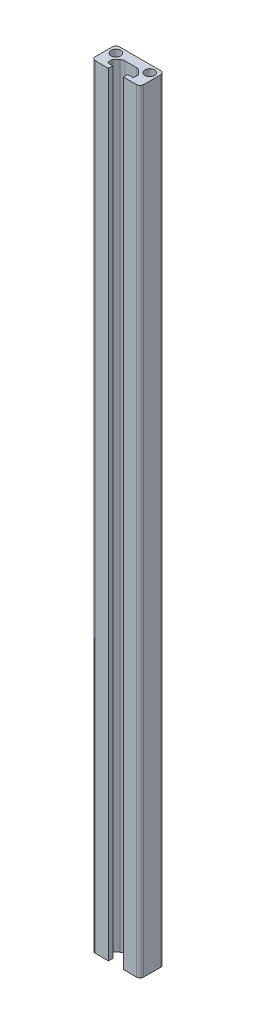
ISO-10303-21;
HEADER;
FILE_DESCRIPTION(('STEP AP214'),'2;1');
FILE_NAME('part.step','',(''),(''),'','','');
FILE_SCHEMA(('AUTOMOTIVE_DESIGN { 1 0 10303 214 1 1 1 1 }'));
ENDSEC;
DATA;
#1=APPLICATION_CONTEXT('core data for automotive mechanical design processes');
#2=APPLICATION_PROTOCOL_DEFINITION('international standard','automotive_design',2000,#1);
#3=PRODUCT_CONTEXT('',#1,'mechanical');
#4=PRODUCT('Part','Part','',(#3));
#5=PRODUCT_RELATED_PRODUCT_CATEGORY('part','',(#4));
#6=PRODUCT_DEFINITION_FORMATION('','',#4);
#7=PRODUCT_DEFINITION_CONTEXT('part definition',#1,'design');
#8=PRODUCT_DEFINITION('design','',#6,#7);
#9=PRODUCT_DEFINITION_SHAPE('','',#8);
#10=(LENGTH_UNIT() NAMED_UNIT(*) SI_UNIT(.MILLI.,.METRE.));
#11=(NAMED_UNIT(*) PLANE_ANGLE_UNIT() SI_UNIT($,.RADIAN.));
#12=(NAMED_UNIT(*) SI_UNIT($,.STERADIAN.) SOLID_ANGLE_UNIT());
#13=UNCERTAINTY_MEASURE_WITH_UNIT(LENGTH_MEASURE(1.E-05),#10,'distance_accuracy_value','');
#14=(GEOMETRIC_REPRESENTATION_CONTEXT(3) GLOBAL_UNCERTAINTY_ASSIGNED_CONTEXT((#13)) GLOBAL_UNIT_ASSIGNED_CONTEXT((#10,
#11,#12)) REPRESENTATION_CONTEXT('',''));
#15=CARTESIAN_POINT('',(0.,0.,0.));
#16=DIRECTION('',(0.,0.,1.));
#17=DIRECTION('',(1.,0.,0.));
#18=AXIS2_PLACEMENT_3D('',#15,#16,#17);
#19=CARTESIAN_POINT('',(-8.5,195.,0.));
#20=DIRECTION('',(0.,0.,-1.));
#21=DIRECTION('',(-1.,0.,0.));
#22=AXIS2_PLACEMENT_3D('',#19,#20,#21);
#23=PLANE('',#22);
#24=DIRECTION('',(1.,0.,0.));
#25=VECTOR('',#24,1.);
#26=CARTESIAN_POINT('',(-8.5,125.,0.));
#27=LINE('',#26,#25);
#28=CARTESIAN_POINT('',(-8.5,125.,0.));
#29=VERTEX_POINT('',#28);
#30=CARTESIAN_POINT('',(-3.1,125.,0.));
#31=VERTEX_POINT('',#30);
#32=EDGE_CURVE('E206',#29,#31,#27,.T.);
#33=ORIENTED_EDGE('',*,*,#32,.F.);
#34=DIRECTION('',(0.,-1.,0.));
#35=VECTOR('',#34,1.);
#36=CARTESIAN_POINT('',(-8.5,195.,0.));
#37=LINE('',#36,#35);
#38=CARTESIAN_POINT('',(-8.5,-195.,0.));
#39=VERTEX_POINT('',#38);
#40=EDGE_CURVE('E307',#29,#39,#37,.T.);
#41=ORIENTED_EDGE('',*,*,#40,.T.);
#42=DIRECTION('',(1.,0.,0.));
#43=VECTOR('',#42,1.);
#44=CARTESIAN_POINT('',(-8.5,-195.,0.));
#45=LINE('',#44,#43);
#46=CARTESIAN_POINT('',(-3.1,-195.,0.));
#47=VERTEX_POINT('',#46);
#48=EDGE_CURVE('E272',#39,#47,#45,.T.);
#49=ORIENTED_EDGE('',*,*,#48,.T.);
#50=DIRECTION('',(0.,1.,0.));
#51=VECTOR('',#50,1.);
#52=CARTESIAN_POINT('',(-3.1,-195.,0.));
#53=LINE('',#52,#51);
#54=EDGE_CURVE('E244',#47,#31,#53,.T.);
#55=ORIENTED_EDGE('',*,*,#54,.T.);
#56=EDGE_LOOP('',(#33,#41,#49,#55));
#57=FACE_BOUND('',#56,.T.);
#58=ADVANCED_FACE('F44',(#57),#23,.F.);
#59=CARTESIAN_POINT('',(-8.5,195.,-8.5));
#60=DIRECTION('',(0.,-1.,0.));
#61=DIRECTION('',(0.,0.,-1.));
#62=AXIS2_PLACEMENT_3D('',#59,#60,#61);
#63=CYLINDRICAL_SURFACE('',#62,1.5);
#64=CARTESIAN_POINT('',(-8.5,125.,-8.5));
#65=DIRECTION('',(0.,1.,0.));
#66=DIRECTION('',(0.,0.,1.));
#67=AXIS2_PLACEMENT_3D('',#64,#65,#66);
#68=CIRCLE('',#67,1.5);
#69=CARTESIAN_POINT('',(-8.5,125.,-10.));
#70=VERTEX_POINT('',#69);
#71=CARTESIAN_POINT('',(-10.,125.,-8.5));
#72=VERTEX_POINT('',#71);
#73=EDGE_CURVE('E443',#70,#72,#68,.T.);
#74=ORIENTED_EDGE('',*,*,#73,.F.);
#75=DIRECTION('',(0.,-1.,0.));
#76=VECTOR('',#75,1.);
#77=CARTESIAN_POINT('',(-8.5,195.,-10.));
#78=LINE('',#77,#76);
#79=CARTESIAN_POINT('',(-8.5,-195.,-10.));
#80=VERTEX_POINT('',#79);
#81=EDGE_CURVE('E292',#70,#80,#78,.T.);
#82=ORIENTED_EDGE('',*,*,#81,.T.);
#83=CARTESIAN_POINT('',(-8.5,-195.,-8.5));
#84=DIRECTION('',(0.,1.,0.));
#85=DIRECTION('',(0.,0.,1.));
#86=AXIS2_PLACEMENT_3D('',#83,#84,#85);
#87=CIRCLE('',#86,1.5);
#88=CARTESIAN_POINT('',(-10.,-195.,-8.5));
#89=VERTEX_POINT('',#88);
#90=EDGE_CURVE('E259',#80,#89,#87,.T.);
#91=ORIENTED_EDGE('',*,*,#90,.T.);
#92=DIRECTION('',(0.,-1.,0.));
#93=VECTOR('',#92,1.);
#94=CARTESIAN_POINT('',(-10.,195.,-8.5));
#95=LINE('',#94,#93);
#96=EDGE_CURVE('E313',#72,#89,#95,.T.);
#97=ORIENTED_EDGE('',*,*,#96,.F.);
#98=EDGE_LOOP('',(#74,#82,#91,#97));
#99=FACE_BOUND('',#98,.T.);
#100=ADVANCED_FACE('F549',(#99),#63,.T.);
#101=CARTESIAN_POINT('',(-10.,195.,-8.5));
#102=DIRECTION('',(1.,0.,0.));
#103=DIRECTION('',(0.,0.,-1.));
#104=AXIS2_PLACEMENT_3D('',#101,#102,#103);
#105=PLANE('',#104);
#106=DIRECTION('',(0.,0.,1.));
#107=VECTOR('',#106,1.);
#108=CARTESIAN_POINT('',(-10.,125.,-8.5));
#109=LINE('',#108,#107);
#110=CARTESIAN_POINT('',(-10.,125.,-1.5));
#111=VERTEX_POINT('',#110);
#112=EDGE_CURVE('E446',#72,#111,#109,.T.);
#113=ORIENTED_EDGE('',*,*,#112,.F.);
#114=ORIENTED_EDGE('',*,*,#96,.T.);
#115=DIRECTION('',(0.,0.,1.));
#116=VECTOR('',#115,1.);
#117=CARTESIAN_POINT('',(-10.,-195.,-8.5));
#118=LINE('',#117,#116);
#119=CARTESIAN_POINT('',(-10.,-195.,-1.5));
#120=VERTEX_POINT('',#119);
#121=EDGE_CURVE('E263',#89,#120,#118,.T.);
#122=ORIENTED_EDGE('',*,*,#121,.T.);
#123=DIRECTION('',(0.,-1.,0.));
#124=VECTOR('',#123,1.);
#125=CARTESIAN_POINT('',(-10.,195.,-1.5));
#126=LINE('',#125,#124);
#127=EDGE_CURVE('E310',#111,#120,#126,.T.);
#128=ORIENTED_EDGE('',*,*,#127,.F.);
#129=EDGE_LOOP('',(#113,#114,#122,#128));
#130=FACE_BOUND('',#129,.T.);
#131=ADVANCED_FACE('F555',(#130),#105,.F.);
#132=CARTESIAN_POINT('',(-8.5,195.,-1.5));
#133=DIRECTION('',(0.,-1.,0.));
#134=DIRECTION('',(0.,0.,-1.));
#135=AXIS2_PLACEMENT_3D('',#132,#133,#134);
#136=CYLINDRICAL_SURFACE('',#135,1.5);
#137=CARTESIAN_POINT('',(-8.5,125.,-1.5));
#138=DIRECTION('',(0.,1.,0.));
#139=DIRECTION('',(0.,0.,1.));
#140=AXIS2_PLACEMENT_3D('',#137,#138,#139);
#141=CIRCLE('',#140,1.5);
#142=EDGE_CURVE('E449',#111,#29,#141,.T.);
#143=ORIENTED_EDGE('',*,*,#142,.F.);
#144=ORIENTED_EDGE('',*,*,#127,.T.);
#145=CARTESIAN_POINT('',(-8.5,-195.,-1.5));
#146=DIRECTION('',(0.,1.,0.));
#147=DIRECTION('',(0.,0.,1.));
#148=AXIS2_PLACEMENT_3D('',#145,#146,#147);
#149=CIRCLE('',#148,1.5);
#150=EDGE_CURVE('E267',#120,#39,#149,.T.);
#151=ORIENTED_EDGE('',*,*,#150,.T.);
#152=ORIENTED_EDGE('',*,*,#40,.F.);
#153=EDGE_LOOP('',(#143,#144,#151,#152));
#154=FACE_BOUND('',#153,.T.);
#155=ADVANCED_FACE('F559',(#154),#136,.T.);
#156=DIRECTION('',(1.,0.,0.));
#157=VECTOR('',#156,1.);
#158=CARTESIAN_POINT('',(3.1,125.,0.));
#159=LINE('',#158,#157);
#160=CARTESIAN_POINT('',(3.1,125.,0.));
#161=VERTEX_POINT('',#160);
#162=CARTESIAN_POINT('',(8.5,125.,0.));
#163=VERTEX_POINT('',#162);
#164=EDGE_CURVE('E428',#161,#163,#159,.T.);
#165=ORIENTED_EDGE('',*,*,#164,.F.);
#166=DIRECTION('',(0.,1.,0.));
#167=VECTOR('',#166,1.);
#168=CARTESIAN_POINT('',(3.1,-195.,0.));
#169=LINE('',#168,#167);
#170=CARTESIAN_POINT('',(3.1,-195.,0.));
#171=VERTEX_POINT('',#170);
#172=EDGE_CURVE('E245',#171,#161,#169,.T.);
#173=ORIENTED_EDGE('',*,*,#172,.F.);
#174=CARTESIAN_POINT('',(8.5,-195.,0.));
#175=VERTEX_POINT('',#174);
#176=EDGE_CURVE('E271',#171,#175,#45,.T.);
#177=ORIENTED_EDGE('',*,*,#176,.T.);
#178=DIRECTION('',(0.,-1.,0.));
#179=VECTOR('',#178,1.);
#180=CARTESIAN_POINT('',(8.5,195.,0.));
#181=LINE('',#180,#179);
#182=EDGE_CURVE('E304',#163,#175,#181,.T.);
#183=ORIENTED_EDGE('',*,*,#182,.F.);
#184=EDGE_LOOP('',(#165,#173,#177,#183));
#185=FACE_BOUND('',#184,.T.);
#186=ADVANCED_FACE('F525',(#185),#23,.F.);
#187=CARTESIAN_POINT('',(8.5,195.,-1.5));
#188=DIRECTION('',(0.,-1.,0.));
#189=DIRECTION('',(0.,0.,-1.));
#190=AXIS2_PLACEMENT_3D('',#187,#188,#189);
#191=CYLINDRICAL_SURFACE('',#190,1.5);
#192=CARTESIAN_POINT('',(8.5,125.,-1.5));
#193=DIRECTION('',(0.,1.,0.));
#194=DIRECTION('',(0.,0.,1.));
#195=AXIS2_PLACEMENT_3D('',#192,#193,#194);
#196=CIRCLE('',#195,1.5);
#197=CARTESIAN_POINT('',(10.,125.,-1.5));
#198=VERTEX_POINT('',#197);
#199=EDGE_CURVE('E431',#163,#198,#196,.T.);
#200=ORIENTED_EDGE('',*,*,#199,.F.);
#201=ORIENTED_EDGE('',*,*,#182,.T.);
#202=CARTESIAN_POINT('',(8.5,-195.,-1.5));
#203=DIRECTION('',(0.,1.,0.));
#204=DIRECTION('',(0.,0.,1.));
#205=AXIS2_PLACEMENT_3D('',#202,#203,#204);
#206=CIRCLE('',#205,1.5);
#207=CARTESIAN_POINT('',(10.,-195.,-1.5));
#208=VERTEX_POINT('',#207);
#209=EDGE_CURVE('E276',#175,#208,#206,.T.);
#210=ORIENTED_EDGE('',*,*,#209,.T.);
#211=DIRECTION('',(0.,-1.,0.));
#212=VECTOR('',#211,1.);
#213=CARTESIAN_POINT('',(10.,195.,-1.5));
#214=LINE('',#213,#212);
#215=EDGE_CURVE('E301',#198,#208,#214,.T.);
#216=ORIENTED_EDGE('',*,*,#215,.F.);
#217=EDGE_LOOP('',(#200,#201,#210,#216));
#218=FACE_BOUND('',#217,.T.);
#219=ADVANCED_FACE('F529',(#218),#191,.T.);
#220=CARTESIAN_POINT('',(10.,195.,-8.5));
#221=DIRECTION('',(-1.,0.,0.));
#222=DIRECTION('',(0.,0.,1.));
#223=AXIS2_PLACEMENT_3D('',#220,#221,#222);
#224=PLANE('',#223);
#225=DIRECTION('',(0.,0.,-1.));
#226=VECTOR('',#225,1.);
#227=CARTESIAN_POINT('',(10.,125.,-1.5));
#228=LINE('',#227,#226);
#229=CARTESIAN_POINT('',(10.,125.,-8.5));
#230=VERTEX_POINT('',#229);
#231=EDGE_CURVE('E434',#198,#230,#228,.T.);
#232=ORIENTED_EDGE('',*,*,#231,.F.);
#233=ORIENTED_EDGE('',*,*,#215,.T.);
#234=DIRECTION('',(0.,0.,-1.));
#235=VECTOR('',#234,1.);
#236=CARTESIAN_POINT('',(10.,-195.,-8.5));
#237=LINE('',#236,#235);
#238=CARTESIAN_POINT('',(10.,-195.,-8.5));
#239=VERTEX_POINT('',#238);
#240=EDGE_CURVE('E280',#208,#239,#237,.T.);
#241=ORIENTED_EDGE('',*,*,#240,.T.);
#242=DIRECTION('',(0.,-1.,0.));
#243=VECTOR('',#242,1.);
#244=CARTESIAN_POINT('',(10.,195.,-8.5));
#245=LINE('',#244,#243);
#246=EDGE_CURVE('E298',#230,#239,#245,.T.);
#247=ORIENTED_EDGE('',*,*,#246,.F.);
#248=EDGE_LOOP('',(#232,#233,#241,#247));
#249=FACE_BOUND('',#248,.T.);
#250=ADVANCED_FACE('F536',(#249),#224,.F.);
#251=CARTESIAN_POINT('',(8.5,195.,-8.5));
#252=DIRECTION('',(0.,-1.,0.));
#253=DIRECTION('',(0.,0.,-1.));
#254=AXIS2_PLACEMENT_3D('',#251,#252,#253);
#255=CYLINDRICAL_SURFACE('',#254,1.5);
#256=CARTESIAN_POINT('',(8.5,125.,-8.5));
#257=DIRECTION('',(0.,1.,0.));
#258=DIRECTION('',(0.,0.,1.));
#259=AXIS2_PLACEMENT_3D('',#256,#257,#258);
#260=CIRCLE('',#259,1.5);
#261=CARTESIAN_POINT('',(8.5,125.,-10.));
#262=VERTEX_POINT('',#261);
#263=EDGE_CURVE('E437',#230,#262,#260,.T.);
#264=ORIENTED_EDGE('',*,*,#263,.F.);
#265=ORIENTED_EDGE('',*,*,#246,.T.);
#266=CARTESIAN_POINT('',(8.5,-195.,-8.5));
#267=DIRECTION('',(0.,1.,0.));
#268=DIRECTION('',(0.,0.,-1.));
#269=AXIS2_PLACEMENT_3D('',#266,#267,#268);
#270=CIRCLE('',#269,1.5);
#271=CARTESIAN_POINT('',(8.5,-195.,-10.));
#272=VERTEX_POINT('',#271);
#273=EDGE_CURVE('E284',#239,#272,#270,.T.);
#274=ORIENTED_EDGE('',*,*,#273,.T.);
#275=DIRECTION('',(0.,-1.,0.));
#276=VECTOR('',#275,1.);
#277=CARTESIAN_POINT('',(8.5,195.,-10.));
#278=LINE('',#277,#276);
#279=EDGE_CURVE('E295',#262,#272,#278,.T.);
#280=ORIENTED_EDGE('',*,*,#279,.F.);
#281=EDGE_LOOP('',(#264,#265,#274,#280));
#282=FACE_BOUND('',#281,.T.);
#283=ADVANCED_FACE('F539',(#282),#255,.T.);
#284=CARTESIAN_POINT('',(-8.5,195.,-10.));
#285=DIRECTION('',(0.,0.,1.));
#286=DIRECTION('',(1.,0.,0.));
#287=AXIS2_PLACEMENT_3D('',#284,#285,#286);
#288=PLANE('',#287);
#289=DIRECTION('',(-1.,0.,0.));
#290=VECTOR('',#289,1.);
#291=CARTESIAN_POINT('',(8.5,125.,-10.));
#292=LINE('',#291,#290);
#293=EDGE_CURVE('E440',#262,#70,#292,.T.);
#294=ORIENTED_EDGE('',*,*,#293,.F.);
#295=ORIENTED_EDGE('',*,*,#279,.T.);
#296=DIRECTION('',(-1.,0.,0.));
#297=VECTOR('',#296,1.);
#298=CARTESIAN_POINT('',(-8.5,-195.,-10.));
#299=LINE('',#298,#297);
#300=EDGE_CURVE('E288',#272,#80,#299,.T.);
#301=ORIENTED_EDGE('',*,*,#300,.T.);
#302=ORIENTED_EDGE('',*,*,#81,.F.);
#303=EDGE_LOOP('',(#294,#295,#301,#302));
#304=FACE_BOUND('',#303,.T.);
#305=ADVANCED_FACE('F546',(#304),#288,.F.);
#306=CARTESIAN_POINT('',(-7.,195.,-7.));
#307=DIRECTION('',(0.,-1.,0.));
#308=DIRECTION('',(0.,0.,-1.));
#309=AXIS2_PLACEMENT_3D('',#306,#307,#308);
#310=CYLINDRICAL_SURFACE('',#309,2.);
#311=CARTESIAN_POINT('',(-7.,-195.,-7.));
#312=DIRECTION('',(0.,1.,0.));
#313=DIRECTION('',(0.,0.,1.));
#314=AXIS2_PLACEMENT_3D('',#311,#312,#313);
#315=CIRCLE('',#314,2.);
#316=CARTESIAN_POINT('',(-7.,-195.,-5.));
#317=VERTEX_POINT('',#316);
#318=EDGE_CURVE('E255',#317,#317,#315,.T.);
#319=ORIENTED_EDGE('',*,*,#318,.F.);
#320=EDGE_LOOP('',(#319));
#321=FACE_BOUND('',#320,.T.);
#322=CARTESIAN_POINT('',(-7.,125.,-7.));
#323=DIRECTION('',(0.,1.,0.));
#324=DIRECTION('',(0.,0.,1.));
#325=AXIS2_PLACEMENT_3D('',#322,#323,#324);
#326=CIRCLE('',#325,2.);
#327=CARTESIAN_POINT('',(-7.,125.,-5.));
#328=VERTEX_POINT('',#327);
#329=EDGE_CURVE('E458',#328,#328,#326,.T.);
#330=ORIENTED_EDGE('',*,*,#329,.T.);
#331=EDGE_LOOP('',(#330));
#332=FACE_BOUND('',#331,.T.);
#333=ADVANCED_FACE('F704',(#321,#332),#310,.F.);
#334=CARTESIAN_POINT('',(7.,195.,-7.));
#335=DIRECTION('',(0.,-1.,0.));
#336=DIRECTION('',(0.,0.,-1.));
#337=AXIS2_PLACEMENT_3D('',#334,#335,#336);
#338=CYLINDRICAL_SURFACE('',#337,2.);
#339=CARTESIAN_POINT('',(7.,-195.,-7.));
#340=DIRECTION('',(0.,1.,0.));
#341=DIRECTION('',(0.,0.,1.));
#342=AXIS2_PLACEMENT_3D('',#339,#340,#341);
#343=CIRCLE('',#342,2.);
#344=CARTESIAN_POINT('',(7.,-195.,-5.));
#345=VERTEX_POINT('',#344);
#346=EDGE_CURVE('E249',#345,#345,#343,.T.);
#347=ORIENTED_EDGE('',*,*,#346,.F.);
#348=EDGE_LOOP('',(#347));
#349=FACE_BOUND('',#348,.T.);
#350=CARTESIAN_POINT('',(7.,125.,-7.));
#351=DIRECTION('',(0.,1.,0.));
#352=DIRECTION('',(0.,0.,1.));
#353=AXIS2_PLACEMENT_3D('',#350,#351,#352);
#354=CIRCLE('',#353,2.);
#355=CARTESIAN_POINT('',(7.,125.,-5.));
#356=VERTEX_POINT('',#355);
#357=EDGE_CURVE('E454',#356,#356,#354,.T.);
#358=ORIENTED_EDGE('',*,*,#357,.T.);
#359=EDGE_LOOP('',(#358));
#360=FACE_BOUND('',#359,.T.);
#361=ADVANCED_FACE('F696',(#349,#360),#338,.F.);
#362=CARTESIAN_POINT('',(-3.1,-195.,-6.1));
#363=DIRECTION('',(-1.,0.,0.));
#364=DIRECTION('',(0.,0.,1.));
#365=AXIS2_PLACEMENT_3D('',#362,#363,#364);
#366=PLANE('',#365);
#367=DIRECTION('',(0.,0.,-1.));
#368=VECTOR('',#367,1.);
#369=CARTESIAN_POINT('',(-3.1,125.,0.));
#370=LINE('',#369,#368);
#371=CARTESIAN_POINT('',(-3.1,125.,-1.8));
#372=VERTEX_POINT('',#371);
#373=EDGE_CURVE('E203',#31,#372,#370,.T.);
#374=ORIENTED_EDGE('',*,*,#373,.F.);
#375=ORIENTED_EDGE('',*,*,#54,.F.);
#376=DIRECTION('',(0.,0.,1.));
#377=VECTOR('',#376,1.);
#378=CARTESIAN_POINT('',(-3.1,-195.,-6.1));
#379=LINE('',#378,#377);
#380=CARTESIAN_POINT('',(-3.1,-195.,-1.8));
#381=VERTEX_POINT('',#380);
#382=EDGE_CURVE('E225',#381,#47,#379,.T.);
#383=ORIENTED_EDGE('',*,*,#382,.F.);
#384=DIRECTION('',(0.,1.,0.));
#385=VECTOR('',#384,1.);
#386=CARTESIAN_POINT('',(-3.1,-195.,-1.8));
#387=LINE('',#386,#385);
#388=EDGE_CURVE('E217',#381,#372,#387,.T.);
#389=ORIENTED_EDGE('',*,*,#388,.T.);
#390=EDGE_LOOP('',(#374,#375,#383,#389));
#391=FACE_BOUND('',#390,.T.);
#392=ADVANCED_FACE('F224',(#391),#366,.F.);
#393=CARTESIAN_POINT('',(-3.1,-195.,-6.1));
#394=DIRECTION('',(0.,0.,-1.));
#395=DIRECTION('',(-1.,0.,0.));
#396=AXIS2_PLACEMENT_3D('',#393,#394,#395);
#397=PLANE('',#396);
#398=DIRECTION('',(1.,0.,0.));
#399=VECTOR('',#398,1.);
#400=CARTESIAN_POINT('',(-2.42157287525381,125.,-6.1));
#401=LINE('',#400,#399);
#402=CARTESIAN_POINT('',(-2.42157287525381,125.,-6.1));
#403=VERTEX_POINT('',#402);
#404=CARTESIAN_POINT('',(2.42157287525381,125.,-6.1));
#405=VERTEX_POINT('',#404);
#406=EDGE_CURVE('E404',#403,#405,#401,.T.);
#407=ORIENTED_EDGE('',*,*,#406,.F.);
#408=DIRECTION('',(0.,1.,0.));
#409=VECTOR('',#408,1.);
#410=CARTESIAN_POINT('',(-2.42157287525381,-195.,-6.1));
#411=LINE('',#410,#409);
#412=CARTESIAN_POINT('',(-2.42157287525381,-195.,-6.1));
#413=VERTEX_POINT('',#412);
#414=EDGE_CURVE('E319',#403,#413,#411,.F.);
#415=ORIENTED_EDGE('',*,*,#414,.T.);
#416=DIRECTION('',(-1.,0.,0.));
#417=VECTOR('',#416,1.);
#418=CARTESIAN_POINT('',(-3.1,-195.,-6.1));
#419=LINE('',#418,#417);
#420=CARTESIAN_POINT('',(2.42157287525381,-195.,-6.1));
#421=VERTEX_POINT('',#420);
#422=EDGE_CURVE('E240',#421,#413,#419,.T.);
#423=ORIENTED_EDGE('',*,*,#422,.F.);
#424=DIRECTION('',(0.,1.,0.));
#425=VECTOR('',#424,1.);
#426=CARTESIAN_POINT('',(2.42157287525381,195.,-6.1));
#427=LINE('',#426,#425);
#428=EDGE_CURVE('E322',#421,#405,#427,.T.);
#429=ORIENTED_EDGE('',*,*,#428,.T.);
#430=EDGE_LOOP('',(#407,#415,#423,#429));
#431=FACE_BOUND('',#430,.T.);
#432=ADVANCED_FACE('F506',(#431),#397,.F.);
#433=CARTESIAN_POINT('',(3.1,-195.,-6.1));
#434=DIRECTION('',(1.,0.,0.));
#435=DIRECTION('',(0.,0.,-1.));
#436=AXIS2_PLACEMENT_3D('',#433,#434,#435);
#437=PLANE('',#436);
#438=DIRECTION('',(0.,0.,1.));
#439=VECTOR('',#438,1.);
#440=CARTESIAN_POINT('',(3.1,125.,-1.8));
#441=LINE('',#440,#439);
#442=CARTESIAN_POINT('',(3.1,125.,-1.8));
#443=VERTEX_POINT('',#442);
#444=EDGE_CURVE('E425',#443,#161,#441,.T.);
#445=ORIENTED_EDGE('',*,*,#444,.F.);
#446=DIRECTION('',(0.,-1.,0.));
#447=VECTOR('',#446,1.);
#448=CARTESIAN_POINT('',(3.1,-195.,-1.8));
#449=LINE('',#448,#447);
#450=CARTESIAN_POINT('',(3.1,-195.,-1.8));
#451=VERTEX_POINT('',#450);
#452=EDGE_CURVE('E316',#443,#451,#449,.T.);
#453=ORIENTED_EDGE('',*,*,#452,.T.);
#454=DIRECTION('',(0.,0.,-1.));
#455=VECTOR('',#454,1.);
#456=CARTESIAN_POINT('',(3.1,-195.,-6.1));
#457=LINE('',#456,#455);
#458=EDGE_CURVE('E231',#171,#451,#457,.T.);
#459=ORIENTED_EDGE('',*,*,#458,.F.);
#460=ORIENTED_EDGE('',*,*,#172,.T.);
#461=EDGE_LOOP('',(#445,#453,#459,#460));
#462=FACE_BOUND('',#461,.T.);
#463=ADVANCED_FACE('F519',(#462),#437,.F.);
#464=CARTESIAN_POINT('',(-5.45,-195.,-1.8));
#465=DIRECTION('',(0.,0.,1.));
#466=DIRECTION('',(1.,0.,0.));
#467=AXIS2_PLACEMENT_3D('',#464,#465,#466);
#468=PLANE('',#467);
#469=DIRECTION('',(-1.,0.,0.));
#470=VECTOR('',#469,1.);
#471=CARTESIAN_POINT('',(4.95,125.,-1.8));
#472=LINE('',#471,#470);
#473=CARTESIAN_POINT('',(4.95,125.,-1.8));
#474=VERTEX_POINT('',#473);
#475=EDGE_CURVE('E422',#474,#443,#472,.T.);
#476=ORIENTED_EDGE('',*,*,#475,.F.);
#477=DIRECTION('',(0.,1.,0.));
#478=VECTOR('',#477,1.);
#479=CARTESIAN_POINT('',(4.95,-195.,-1.8));
#480=LINE('',#479,#478);
#481=CARTESIAN_POINT('',(4.95,-195.,-1.8));
#482=VERTEX_POINT('',#481);
#483=EDGE_CURVE('E350',#474,#482,#480,.F.);
#484=ORIENTED_EDGE('',*,*,#483,.T.);
#485=DIRECTION('',(1.,0.,0.));
#486=VECTOR('',#485,1.);
#487=CARTESIAN_POINT('',(-5.45,-195.,-1.8));
#488=LINE('',#487,#486);
#489=EDGE_CURVE('E233',#451,#482,#488,.T.);
#490=ORIENTED_EDGE('',*,*,#489,.F.);
#491=ORIENTED_EDGE('',*,*,#452,.F.);
#492=EDGE_LOOP('',(#476,#484,#490,#491));
#493=FACE_BOUND('',#492,.T.);
#494=ADVANCED_FACE('F517',(#493),#468,.F.);
#495=CARTESIAN_POINT('',(3.25,-195.,-6.1));
#496=DIRECTION('',(0.707106781186548,0.,-0.707106781186548));
#497=DIRECTION('',(-0.707106781186548,0.,-0.707106781186548));
#498=AXIS2_PLACEMENT_3D('',#495,#496,#497);
#499=PLANE('',#498);
#500=DIRECTION('',(0.707106781186546,0.,0.707106781186549));
#501=VECTOR('',#500,1.);
#502=CARTESIAN_POINT('',(3.8357864376269,125.,-5.5142135623731));
#503=LINE('',#502,#501);
#504=CARTESIAN_POINT('',(3.8357864376269,125.,-5.5142135623731));
#505=VERTEX_POINT('',#504);
#506=CARTESIAN_POINT('',(5.30355339059327,125.,-4.04644660940673));
#507=VERTEX_POINT('',#506);
#508=EDGE_CURVE('E410',#505,#507,#503,.T.);
#509=ORIENTED_EDGE('',*,*,#508,.F.);
#510=DIRECTION('',(0.,1.,0.));
#511=VECTOR('',#510,1.);
#512=CARTESIAN_POINT('',(3.83578643762691,-195.,-5.5142135623731));
#513=LINE('',#512,#511);
#514=CARTESIAN_POINT('',(3.83578643762691,-195.,-5.5142135623731));
#515=VERTEX_POINT('',#514);
#516=EDGE_CURVE('E326',#505,#515,#513,.F.);
#517=ORIENTED_EDGE('',*,*,#516,.T.);
#518=DIRECTION('',(-0.707106781186548,0.,-0.707106781186548));
#519=VECTOR('',#518,1.);
#520=CARTESIAN_POINT('',(3.25,-195.,-6.1));
#521=LINE('',#520,#519);
#522=CARTESIAN_POINT('',(5.30355339059327,-195.,-4.04644660940673));
#523=VERTEX_POINT('',#522);
#524=EDGE_CURVE('E466',#523,#515,#521,.T.);
#525=ORIENTED_EDGE('',*,*,#524,.F.);
#526=DIRECTION('',(0.,1.,0.));
#527=VECTOR('',#526,1.);
#528=CARTESIAN_POINT('',(5.30355339059327,195.,-4.04644660940673));
#529=LINE('',#528,#527);
#530=EDGE_CURVE('E339',#523,#507,#529,.T.);
#531=ORIENTED_EDGE('',*,*,#530,.T.);
#532=EDGE_LOOP('',(#509,#517,#525,#531));
#533=FACE_BOUND('',#532,.T.);
#534=ADVANCED_FACE('F496',(#533),#499,.F.);
#535=CARTESIAN_POINT('',(5.45,-195.,-3.9));
#536=DIRECTION('',(1.,0.,0.));
#537=DIRECTION('',(0.,0.,-1.));
#538=AXIS2_PLACEMENT_3D('',#535,#536,#537);
#539=PLANE('',#538);
#540=DIRECTION('',(0.,0.,1.));
#541=VECTOR('',#540,1.);
#542=CARTESIAN_POINT('',(5.45,125.,-3.69289321881346));
#543=LINE('',#542,#541);
#544=CARTESIAN_POINT('',(5.45,125.,-3.69289321881346));
#545=VERTEX_POINT('',#544);
#546=CARTESIAN_POINT('',(5.45,125.,-2.3));
#547=VERTEX_POINT('',#546);
#548=EDGE_CURVE('E416',#545,#547,#543,.T.);
#549=ORIENTED_EDGE('',*,*,#548,.F.);
#550=DIRECTION('',(0.,1.,0.));
#551=VECTOR('',#550,1.);
#552=CARTESIAN_POINT('',(5.45,-195.,-3.69289321881346));
#553=LINE('',#552,#551);
#554=CARTESIAN_POINT('',(5.45,-195.,-3.69289321881346));
#555=VERTEX_POINT('',#554);
#556=EDGE_CURVE('E347',#545,#555,#553,.F.);
#557=ORIENTED_EDGE('',*,*,#556,.T.);
#558=DIRECTION('',(0.,0.,-1.));
#559=VECTOR('',#558,1.);
#560=CARTESIAN_POINT('',(5.45,-195.,-3.9));
#561=LINE('',#560,#559);
#562=CARTESIAN_POINT('',(5.45,-195.,-2.3));
#563=VERTEX_POINT('',#562);
#564=EDGE_CURVE('E462',#563,#555,#561,.T.);
#565=ORIENTED_EDGE('',*,*,#564,.F.);
#566=DIRECTION('',(0.,1.,0.));
#567=VECTOR('',#566,1.);
#568=CARTESIAN_POINT('',(5.45,195.,-2.3));
#569=LINE('',#568,#567);
#570=EDGE_CURVE('E343',#563,#547,#569,.T.);
#571=ORIENTED_EDGE('',*,*,#570,.T.);
#572=EDGE_LOOP('',(#549,#557,#565,#571));
#573=FACE_BOUND('',#572,.T.);
#574=ADVANCED_FACE('F486',(#573),#539,.F.);
#575=DIRECTION('',(-1.,0.,0.));
#576=VECTOR('',#575,1.);
#577=CARTESIAN_POINT('',(-3.1,125.,-1.8));
#578=LINE('',#577,#576);
#579=CARTESIAN_POINT('',(-4.95,125.,-1.8));
#580=VERTEX_POINT('',#579);
#581=EDGE_CURVE('E60',#372,#580,#578,.T.);
#582=ORIENTED_EDGE('',*,*,#581,.F.);
#583=ORIENTED_EDGE('',*,*,#388,.F.);
#584=CARTESIAN_POINT('',(-4.95,-195.,-1.8));
#585=VERTEX_POINT('',#584);
#586=EDGE_CURVE('E227',#585,#381,#488,.T.);
#587=ORIENTED_EDGE('',*,*,#586,.F.);
#588=DIRECTION('',(0.,1.,0.));
#589=VECTOR('',#588,1.);
#590=CARTESIAN_POINT('',(-4.95,195.,-1.8));
#591=LINE('',#590,#589);
#592=EDGE_CURVE('E220',#585,#580,#591,.T.);
#593=ORIENTED_EDGE('',*,*,#592,.T.);
#594=EDGE_LOOP('',(#582,#583,#587,#593));
#595=FACE_BOUND('',#594,.T.);
#596=ADVANCED_FACE('F216',(#595),#468,.F.);
#597=CARTESIAN_POINT('',(-5.45,-195.,-3.9));
#598=DIRECTION('',(-1.,0.,0.));
#599=DIRECTION('',(0.,0.,1.));
#600=AXIS2_PLACEMENT_3D('',#597,#598,#599);
#601=PLANE('',#600);
#602=DIRECTION('',(0.,0.,-1.));
#603=VECTOR('',#602,1.);
#604=CARTESIAN_POINT('',(-5.45,125.,-2.3));
#605=LINE('',#604,#603);
#606=CARTESIAN_POINT('',(-5.45,125.,-2.3));
#607=VERTEX_POINT('',#606);
#608=CARTESIAN_POINT('',(-5.45,125.,-3.69289321881346));
#609=VERTEX_POINT('',#608);
#610=EDGE_CURVE('E393',#607,#609,#605,.T.);
#611=ORIENTED_EDGE('',*,*,#610,.F.);
#612=DIRECTION('',(0.,1.,0.));
#613=VECTOR('',#612,1.);
#614=CARTESIAN_POINT('',(-5.45,-195.,-2.3));
#615=LINE('',#614,#613);
#616=CARTESIAN_POINT('',(-5.45,-195.,-2.3));
#617=VERTEX_POINT('',#616);
#618=EDGE_CURVE('E353',#607,#617,#615,.F.);
#619=ORIENTED_EDGE('',*,*,#618,.T.);
#620=DIRECTION('',(0.,0.,1.));
#621=VECTOR('',#620,1.);
#622=CARTESIAN_POINT('',(-5.45,-195.,-3.9));
#623=LINE('',#622,#621);
#624=CARTESIAN_POINT('',(-5.45,-195.,-3.69289321881346));
#625=VERTEX_POINT('',#624);
#626=EDGE_CURVE('E376',#625,#617,#623,.T.);
#627=ORIENTED_EDGE('',*,*,#626,.F.);
#628=DIRECTION('',(0.,1.,0.));
#629=VECTOR('',#628,1.);
#630=CARTESIAN_POINT('',(-5.45,195.,-3.69289321881346));
#631=LINE('',#630,#629);
#632=EDGE_CURVE('E356',#625,#609,#631,.T.);
#633=ORIENTED_EDGE('',*,*,#632,.T.);
#634=EDGE_LOOP('',(#611,#619,#627,#633));
#635=FACE_BOUND('',#634,.T.);
#636=ADVANCED_FACE('F384',(#635),#601,.F.);
#637=CARTESIAN_POINT('',(-5.45,-195.,-3.9));
#638=DIRECTION('',(-0.707106781186548,0.,-0.707106781186548));
#639=DIRECTION('',(-0.707106781186548,0.,0.707106781186548));
#640=AXIS2_PLACEMENT_3D('',#637,#638,#639);
#641=PLANE('',#640);
#642=DIRECTION('',(0.707106781186546,0.,-0.707106781186549));
#643=VECTOR('',#642,1.);
#644=CARTESIAN_POINT('',(-5.30355339059327,125.,-4.04644660940673));
#645=LINE('',#644,#643);
#646=CARTESIAN_POINT('',(-5.30355339059327,125.,-4.04644660940673));
#647=VERTEX_POINT('',#646);
#648=CARTESIAN_POINT('',(-3.83578643762691,125.,-5.5142135623731));
#649=VERTEX_POINT('',#648);
#650=EDGE_CURVE('E392',#647,#649,#645,.T.);
#651=ORIENTED_EDGE('',*,*,#650,.F.);
#652=DIRECTION('',(0.,1.,0.));
#653=VECTOR('',#652,1.);
#654=CARTESIAN_POINT('',(-5.30355339059327,-195.,-4.04644660940673));
#655=LINE('',#654,#653);
#656=CARTESIAN_POINT('',(-5.30355339059327,-195.,-4.04644660940673));
#657=VERTEX_POINT('',#656);
#658=EDGE_CURVE('E360',#647,#657,#655,.F.);
#659=ORIENTED_EDGE('',*,*,#658,.T.);
#660=DIRECTION('',(-0.707106781186548,0.,0.707106781186548));
#661=VECTOR('',#660,1.);
#662=CARTESIAN_POINT('',(-5.45,-195.,-3.9));
#663=LINE('',#662,#661);
#664=CARTESIAN_POINT('',(-3.83578643762691,-195.,-5.5142135623731));
#665=VERTEX_POINT('',#664);
#666=EDGE_CURVE('E378',#665,#657,#663,.T.);
#667=ORIENTED_EDGE('',*,*,#666,.F.);
#668=DIRECTION('',(0.,1.,0.));
#669=VECTOR('',#668,1.);
#670=CARTESIAN_POINT('',(-3.83578643762691,195.,-5.5142135623731));
#671=LINE('',#670,#669);
#672=EDGE_CURVE('E329',#665,#649,#671,.T.);
#673=ORIENTED_EDGE('',*,*,#672,.T.);
#674=EDGE_LOOP('',(#651,#659,#667,#673));
#675=FACE_BOUND('',#674,.T.);
#676=ADVANCED_FACE('F514',(#675),#641,.F.);
#677=CARTESIAN_POINT('',(2.42157287525381,-195.,-4.1));
#678=DIRECTION('',(0.,-1.,0.));
#679=DIRECTION('',(0.,0.,-1.));
#680=AXIS2_PLACEMENT_3D('',#677,#678,#679);
#681=CYLINDRICAL_SURFACE('',#680,2.);
#682=CARTESIAN_POINT('',(2.42157287525381,125.,-4.1));
#683=DIRECTION('',(0.,-1.,0.));
#684=DIRECTION('',(0.,0.,1.));
#685=AXIS2_PLACEMENT_3D('',#682,#683,#684);
#686=CIRCLE('',#685,2.);
#687=EDGE_CURVE('E407',#405,#505,#686,.T.);
#688=ORIENTED_EDGE('',*,*,#687,.F.);
#689=ORIENTED_EDGE('',*,*,#428,.F.);
#690=CARTESIAN_POINT('',(2.42157287525381,-195.,-4.1));
#691=DIRECTION('',(0.,1.,0.));
#692=DIRECTION('',(0.,0.,1.));
#693=AXIS2_PLACEMENT_3D('',#690,#691,#692);
#694=CIRCLE('',#693,2.);
#695=EDGE_CURVE('E333',#515,#421,#694,.T.);
#696=ORIENTED_EDGE('',*,*,#695,.F.);
#697=ORIENTED_EDGE('',*,*,#516,.F.);
#698=EDGE_LOOP('',(#688,#689,#696,#697));
#699=FACE_BOUND('',#698,.T.);
#700=ADVANCED_FACE('F503',(#699),#681,.F.);
#701=CARTESIAN_POINT('',(-2.42157287525381,-195.,-4.1));
#702=DIRECTION('',(0.,-1.,0.));
#703=DIRECTION('',(0.,0.,-1.));
#704=AXIS2_PLACEMENT_3D('',#701,#702,#703);
#705=CYLINDRICAL_SURFACE('',#704,2.);
#706=CARTESIAN_POINT('',(-2.42157287525381,125.,-4.1));
#707=DIRECTION('',(0.,-1.,0.));
#708=DIRECTION('',(0.,0.,1.));
#709=AXIS2_PLACEMENT_3D('',#706,#707,#708);
#710=CIRCLE('',#709,2.);
#711=EDGE_CURVE('E397',#649,#403,#710,.T.);
#712=ORIENTED_EDGE('',*,*,#711,.F.);
#713=ORIENTED_EDGE('',*,*,#672,.F.);
#714=CARTESIAN_POINT('',(-2.42157287525381,-195.,-4.1));
#715=DIRECTION('',(0.,1.,0.));
#716=DIRECTION('',(0.,0.,1.));
#717=AXIS2_PLACEMENT_3D('',#714,#715,#716);
#718=CIRCLE('',#717,2.);
#719=EDGE_CURVE('E336',#413,#665,#718,.T.);
#720=ORIENTED_EDGE('',*,*,#719,.F.);
#721=ORIENTED_EDGE('',*,*,#414,.F.);
#722=EDGE_LOOP('',(#712,#713,#720,#721));
#723=FACE_BOUND('',#722,.T.);
#724=ADVANCED_FACE('F512',(#723),#705,.F.);
#725=CARTESIAN_POINT('',(4.95,-195.,-3.69289321881346));
#726=DIRECTION('',(0.,-1.,0.));
#727=DIRECTION('',(0.,0.,-1.));
#728=AXIS2_PLACEMENT_3D('',#725,#726,#727);
#729=CYLINDRICAL_SURFACE('',#728,0.5);
#730=CARTESIAN_POINT('',(4.95,125.,-3.69289321881346));
#731=DIRECTION('',(0.,-1.,0.));
#732=DIRECTION('',(0.,0.,1.));
#733=AXIS2_PLACEMENT_3D('',#730,#731,#732);
#734=CIRCLE('',#733,0.499999999999996);
#735=EDGE_CURVE('E413',#507,#545,#734,.T.);
#736=ORIENTED_EDGE('',*,*,#735,.F.);
#737=ORIENTED_EDGE('',*,*,#530,.F.);
#738=CARTESIAN_POINT('',(4.95,-195.,-3.69289321881346));
#739=DIRECTION('',(0.,1.,0.));
#740=DIRECTION('',(0.,0.,1.));
#741=AXIS2_PLACEMENT_3D('',#738,#739,#740);
#742=CIRCLE('',#741,0.5);
#743=EDGE_CURVE('E365',#555,#523,#742,.T.);
#744=ORIENTED_EDGE('',*,*,#743,.F.);
#745=ORIENTED_EDGE('',*,*,#556,.F.);
#746=EDGE_LOOP('',(#736,#737,#744,#745));
#747=FACE_BOUND('',#746,.T.);
#748=ADVANCED_FACE('F493',(#747),#729,.F.);
#749=CARTESIAN_POINT('',(4.95,-195.,-2.3));
#750=DIRECTION('',(0.,-1.,0.));
#751=DIRECTION('',(0.,0.,-1.));
#752=AXIS2_PLACEMENT_3D('',#749,#750,#751);
#753=CYLINDRICAL_SURFACE('',#752,0.5);
#754=CARTESIAN_POINT('',(4.95,125.,-2.3));
#755=DIRECTION('',(0.,-1.,0.));
#756=DIRECTION('',(0.,0.,1.));
#757=AXIS2_PLACEMENT_3D('',#754,#755,#756);
#758=CIRCLE('',#757,0.5);
#759=EDGE_CURVE('E419',#547,#474,#758,.T.);
#760=ORIENTED_EDGE('',*,*,#759,.F.);
#761=ORIENTED_EDGE('',*,*,#570,.F.);
#762=CARTESIAN_POINT('',(4.95,-195.,-2.3));
#763=DIRECTION('',(0.,1.,0.));
#764=DIRECTION('',(0.,0.,1.));
#765=AXIS2_PLACEMENT_3D('',#762,#763,#764);
#766=CIRCLE('',#765,0.5);
#767=EDGE_CURVE('E368',#482,#563,#766,.T.);
#768=ORIENTED_EDGE('',*,*,#767,.F.);
#769=ORIENTED_EDGE('',*,*,#483,.F.);
#770=EDGE_LOOP('',(#760,#761,#768,#769));
#771=FACE_BOUND('',#770,.T.);
#772=ADVANCED_FACE('F483',(#771),#753,.F.);
#773=CARTESIAN_POINT('',(-4.95,-195.,-3.69289321881346));
#774=DIRECTION('',(0.,-1.,0.));
#775=DIRECTION('',(0.,0.,-1.));
#776=AXIS2_PLACEMENT_3D('',#773,#774,#775);
#777=CYLINDRICAL_SURFACE('',#776,0.5);
#778=CARTESIAN_POINT('',(-4.95,125.,-3.69289321881346));
#779=DIRECTION('',(0.,-1.,0.));
#780=DIRECTION('',(0.,0.,1.));
#781=AXIS2_PLACEMENT_3D('',#778,#779,#780);
#782=CIRCLE('',#781,0.499999999999998);
#783=EDGE_CURVE('E389',#609,#647,#782,.T.);
#784=ORIENTED_EDGE('',*,*,#783,.F.);
#785=ORIENTED_EDGE('',*,*,#632,.F.);
#786=CARTESIAN_POINT('',(-4.95,-195.,-3.69289321881346));
#787=DIRECTION('',(0.,1.,0.));
#788=DIRECTION('',(0.,0.,1.));
#789=AXIS2_PLACEMENT_3D('',#786,#787,#788);
#790=CIRCLE('',#789,0.5);
#791=EDGE_CURVE('E53',#657,#625,#790,.T.);
#792=ORIENTED_EDGE('',*,*,#791,.F.);
#793=ORIENTED_EDGE('',*,*,#658,.F.);
#794=EDGE_LOOP('',(#784,#785,#792,#793));
#795=FACE_BOUND('',#794,.T.);
#796=ADVANCED_FACE('F388',(#795),#777,.F.);
#797=CARTESIAN_POINT('',(-4.95,-195.,-2.3));
#798=DIRECTION('',(0.,-1.,0.));
#799=DIRECTION('',(0.,0.,-1.));
#800=AXIS2_PLACEMENT_3D('',#797,#798,#799);
#801=CYLINDRICAL_SURFACE('',#800,0.5);
#802=CARTESIAN_POINT('',(-4.95,125.,-2.3));
#803=DIRECTION('',(0.,-1.,0.));
#804=DIRECTION('',(0.,0.,1.));
#805=AXIS2_PLACEMENT_3D('',#802,#803,#804);
#806=CIRCLE('',#805,0.5);
#807=EDGE_CURVE('E222',#580,#607,#806,.T.);
#808=ORIENTED_EDGE('',*,*,#807,.F.);
#809=ORIENTED_EDGE('',*,*,#592,.F.);
#810=CARTESIAN_POINT('',(-4.95,-195.,-2.3));
#811=DIRECTION('',(0.,1.,0.));
#812=DIRECTION('',(0.,0.,1.));
#813=AXIS2_PLACEMENT_3D('',#810,#811,#812);
#814=CIRCLE('',#813,0.5);
#815=EDGE_CURVE('E11',#617,#585,#814,.T.);
#816=ORIENTED_EDGE('',*,*,#815,.F.);
#817=ORIENTED_EDGE('',*,*,#618,.F.);
#818=EDGE_LOOP('',(#808,#809,#816,#817));
#819=FACE_BOUND('',#818,.T.);
#820=ADVANCED_FACE('F46',(#819),#801,.F.);
#821=CARTESIAN_POINT('',(-8.5,-195.,-8.5));
#822=DIRECTION('',(0.,1.,0.));
#823=DIRECTION('',(0.,0.,1.));
#824=AXIS2_PLACEMENT_3D('',#821,#822,#823);
#825=PLANE('',#824);
#826=ORIENTED_EDGE('',*,*,#666,.T.);
#827=ORIENTED_EDGE('',*,*,#791,.T.);
#828=ORIENTED_EDGE('',*,*,#626,.T.);
#829=ORIENTED_EDGE('',*,*,#815,.T.);
#830=ORIENTED_EDGE('',*,*,#586,.T.);
#831=ORIENTED_EDGE('',*,*,#382,.T.);
#832=ORIENTED_EDGE('',*,*,#48,.F.);
#833=ORIENTED_EDGE('',*,*,#150,.F.);
#834=ORIENTED_EDGE('',*,*,#121,.F.);
#835=ORIENTED_EDGE('',*,*,#90,.F.);
#836=ORIENTED_EDGE('',*,*,#300,.F.);
#837=ORIENTED_EDGE('',*,*,#273,.F.);
#838=ORIENTED_EDGE('',*,*,#240,.F.);
#839=ORIENTED_EDGE('',*,*,#209,.F.);
#840=ORIENTED_EDGE('',*,*,#176,.F.);
#841=ORIENTED_EDGE('',*,*,#458,.T.);
#842=ORIENTED_EDGE('',*,*,#489,.T.);
#843=ORIENTED_EDGE('',*,*,#767,.T.);
#844=ORIENTED_EDGE('',*,*,#564,.T.);
#845=ORIENTED_EDGE('',*,*,#743,.T.);
#846=ORIENTED_EDGE('',*,*,#524,.T.);
#847=ORIENTED_EDGE('',*,*,#695,.T.);
#848=ORIENTED_EDGE('',*,*,#422,.T.);
#849=ORIENTED_EDGE('',*,*,#719,.T.);
#850=EDGE_LOOP('',(#826,#827,#828,#829,#830,#831,#832,#833,#834,#835,#836,#837,#838,#839,#840,
#841,#842,#843,#844,#845,#846,#847,#848,#849));
#851=FACE_BOUND('',#850,.T.);
#852=ORIENTED_EDGE('',*,*,#318,.T.);
#853=EDGE_LOOP('',(#852));
#854=FACE_BOUND('',#853,.T.);
#855=ORIENTED_EDGE('',*,*,#346,.T.);
#856=EDGE_LOOP('',(#855));
#857=FACE_BOUND('',#856,.T.);
#858=ADVANCED_FACE('F374',(#851,#854,#857),#825,.F.);
#859=CARTESIAN_POINT('',(-4.95,125.,-2.3));
#860=DIRECTION('',(0.,1.,0.));
#861=DIRECTION('',(0.,0.,1.));
#862=AXIS2_PLACEMENT_3D('',#859,#860,#861);
#863=PLANE('',#862);
#864=ORIENTED_EDGE('',*,*,#329,.F.);
#865=EDGE_LOOP('',(#864));
#866=FACE_BOUND('',#865,.T.);
#867=ORIENTED_EDGE('',*,*,#357,.F.);
#868=EDGE_LOOP('',(#867));
#869=FACE_BOUND('',#868,.T.);
#870=ORIENTED_EDGE('',*,*,#373,.T.);
#871=ORIENTED_EDGE('',*,*,#581,.T.);
#872=ORIENTED_EDGE('',*,*,#807,.T.);
#873=ORIENTED_EDGE('',*,*,#610,.T.);
#874=ORIENTED_EDGE('',*,*,#783,.T.);
#875=ORIENTED_EDGE('',*,*,#650,.T.);
#876=ORIENTED_EDGE('',*,*,#711,.T.);
#877=ORIENTED_EDGE('',*,*,#406,.T.);
#878=ORIENTED_EDGE('',*,*,#687,.T.);
#879=ORIENTED_EDGE('',*,*,#508,.T.);
#880=ORIENTED_EDGE('',*,*,#735,.T.);
#881=ORIENTED_EDGE('',*,*,#548,.T.);
#882=ORIENTED_EDGE('',*,*,#759,.T.);
#883=ORIENTED_EDGE('',*,*,#475,.T.);
#884=ORIENTED_EDGE('',*,*,#444,.T.);
#885=ORIENTED_EDGE('',*,*,#164,.T.);
#886=ORIENTED_EDGE('',*,*,#199,.T.);
#887=ORIENTED_EDGE('',*,*,#231,.T.);
#888=ORIENTED_EDGE('',*,*,#263,.T.);
#889=ORIENTED_EDGE('',*,*,#293,.T.);
#890=ORIENTED_EDGE('',*,*,#73,.T.);
#891=ORIENTED_EDGE('',*,*,#112,.T.);
#892=ORIENTED_EDGE('',*,*,#142,.T.);
#893=ORIENTED_EDGE('',*,*,#32,.T.);
#894=EDGE_LOOP('',(#870,#871,#872,#873,#874,#875,#876,#877,#878,#879,#880,#881,#882,#883,#884,
#885,#886,#887,#888,#889,#890,#891,#892,#893));
#895=FACE_BOUND('',#894,.T.);
#896=ADVANCED_FACE('F204',(#866,#869,#895),#863,.T.);
#897=CLOSED_SHELL('',(#58,#100,#131,#155,#186,#219,#250,#283,#305,#333,#361,#392,#432,#463,#494,
#534,#574,#596,#636,#676,#700,#724,#748,#772,#796,#820,#858,#896));
#898=MANIFOLD_SOLID_BREP('B2',#897);
#899=ADVANCED_BREP_SHAPE_REPRESENTATION('',(#18,#898),#14);
#900=SHAPE_DEFINITION_REPRESENTATION(#9,#899);
ENDSEC;
END-ISO-10303-21;
